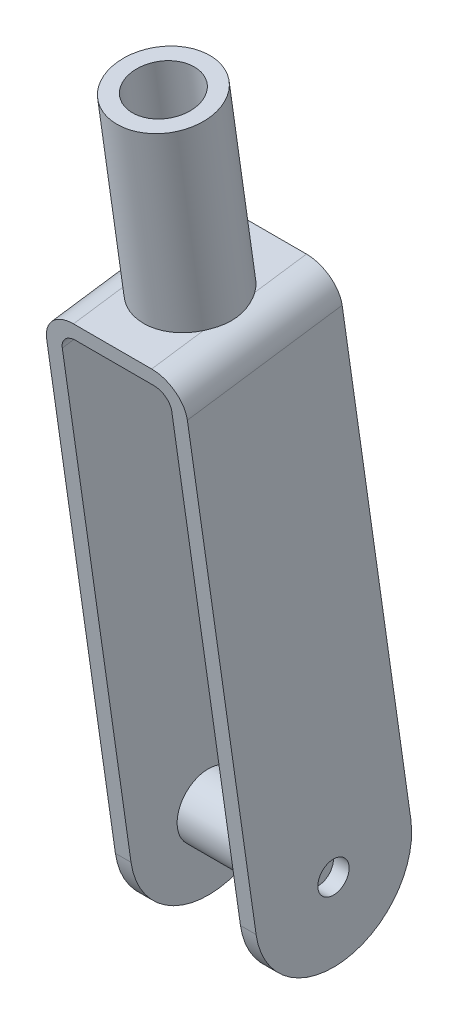
ISO-10303-21;
HEADER;
FILE_DESCRIPTION(('STEP AP214'),'2;1');
FILE_NAME('part.step','',(''),(''),'','','');
FILE_SCHEMA(('AUTOMOTIVE_DESIGN { 1 0 10303 214 1 1 1 1 }'));
ENDSEC;
DATA;
#1=APPLICATION_CONTEXT('core data for automotive mechanical design processes');
#2=APPLICATION_PROTOCOL_DEFINITION('international standard','automotive_design',2000,#1);
#3=PRODUCT_CONTEXT('',#1,'mechanical');
#4=PRODUCT('Part','Part','',(#3));
#5=PRODUCT_RELATED_PRODUCT_CATEGORY('part','',(#4));
#6=PRODUCT_DEFINITION_FORMATION('','',#4);
#7=PRODUCT_DEFINITION_CONTEXT('part definition',#1,'design');
#8=PRODUCT_DEFINITION('design','',#6,#7);
#9=PRODUCT_DEFINITION_SHAPE('','',#8);
#10=(LENGTH_UNIT() NAMED_UNIT(*) SI_UNIT(.MILLI.,.METRE.));
#11=(NAMED_UNIT(*) PLANE_ANGLE_UNIT() SI_UNIT($,.RADIAN.));
#12=(NAMED_UNIT(*) SI_UNIT($,.STERADIAN.) SOLID_ANGLE_UNIT());
#13=UNCERTAINTY_MEASURE_WITH_UNIT(LENGTH_MEASURE(1.E-05),#10,'distance_accuracy_value','');
#14=(GEOMETRIC_REPRESENTATION_CONTEXT(3) GLOBAL_UNCERTAINTY_ASSIGNED_CONTEXT((#13)) GLOBAL_UNIT_ASSIGNED_CONTEXT((#10,
#11,#12)) REPRESENTATION_CONTEXT('',''));
#15=CARTESIAN_POINT('',(0.,0.,0.));
#16=DIRECTION('',(0.,0.,1.));
#17=DIRECTION('',(1.,0.,0.));
#18=AXIS2_PLACEMENT_3D('',#15,#16,#17);
#19=CARTESIAN_POINT('',(83.7499999999986,659.76098798827,-425.51857586841));
#20=DIRECTION('',(-1.,0.,0.));
#21=DIRECTION('',(0.,0.,1.));
#22=AXIS2_PLACEMENT_3D('',#19,#20,#21);
#23=PLANE('',#22);
#24=CARTESIAN_POINT('',(83.7499999999986,660.24088916742,-424.87823749785));
#25=DIRECTION('',(1.,0.,0.));
#26=DIRECTION('',(0.,0.,-1.));
#27=AXIS2_PLACEMENT_3D('',#24,#25,#26);
#28=CIRCLE('',#27,0.499999999999901);
#29=CARTESIAN_POINT('',(83.7499999999986,660.24088916742,-425.37823749785));
#30=VERTEX_POINT('',#29);
#31=EDGE_CURVE('E183',#30,#30,#28,.T.);
#32=ORIENTED_EDGE('',*,*,#31,.T.);
#33=EDGE_LOOP('',(#32));
#34=FACE_BOUND('',#33,.T.);
#35=ADVANCED_FACE('F17',(#34),#23,.F.);
#36=CARTESIAN_POINT('',(80.4999999999986,682.300974259695,-420.203556148117));
#37=DIRECTION('',(0.,0.9898995803359,0.141770310188026));
#38=DIRECTION('',(0.,-0.141770310188026,0.9898995803359));
#39=AXIS2_PLACEMENT_3D('',#36,#37,#38);
#40=PLANE('',#39);
#41=CARTESIAN_POINT('',(81.9999999999987,682.513629724977,-421.688405518621));
#42=DIRECTION('',(0.,-0.989899580335903,-0.141770310188003));
#43=DIRECTION('',(0.,0.141770310188003,-0.989899580335903));
#44=AXIS2_PLACEMENT_3D('',#41,#42,#43);
#45=CIRCLE('',#44,1.00000000000017);
#46=CARTESIAN_POINT('',(81.9999999999987,682.655400035165,-422.678305098957));
#47=VERTEX_POINT('',#46);
#48=EDGE_CURVE('E321',#47,#47,#45,.T.);
#49=ORIENTED_EDGE('',*,*,#48,.T.);
#50=EDGE_LOOP('',(#49));
#51=FACE_BOUND('',#50,.T.);
#52=CARTESIAN_POINT('',(81.9999999999987,682.513629724977,-421.68840551862));
#53=DIRECTION('',(0.,0.989899580335898,0.141770310188037));
#54=DIRECTION('',(0.,-0.141770310188037,0.989899580335898));
#55=AXIS2_PLACEMENT_3D('',#52,#53,#54);
#56=CIRCLE('',#55,1.50000000000002);
#57=CARTESIAN_POINT('',(81.9999999999987,682.300974259695,-420.203556148117));
#58=VERTEX_POINT('',#57);
#59=EDGE_CURVE('E213',#58,#58,#56,.F.);
#60=ORIENTED_EDGE('',*,*,#59,.F.);
#61=EDGE_LOOP('',(#60));
#62=FACE_BOUND('',#61,.T.);
#63=ADVANCED_FACE('F270',(#51,#62),#40,.T.);
#64=CARTESIAN_POINT('',(80.7499999999986,675.584332662626,-422.680797689937));
#65=DIRECTION('',(0.,0.141770310188011,-0.989899580335902));
#66=DIRECTION('',(0.,0.989899580335902,0.141770310188011));
#67=AXIS2_PLACEMENT_3D('',#64,#65,#66);
#68=CYLINDRICAL_SURFACE('',#67,0.5);
#69=DIRECTION('',(0.,-0.14177031018802,0.989899580335901));
#70=VECTOR('',#69,1.);
#71=CARTESIAN_POINT('',(80.2499999999986,675.938758438096,-425.155546640776));
#72=LINE('',#71,#70);
#73=CARTESIAN_POINT('',(80.2499999999986,675.938758438096,-425.155546640776));
#74=VERTEX_POINT('',#73);
#75=CARTESIAN_POINT('',(80.2499999999986,675.229906887156,-420.206048739097));
#76=VERTEX_POINT('',#75);
#77=EDGE_CURVE('E120',#74,#76,#72,.T.);
#78=ORIENTED_EDGE('',*,*,#77,.F.);
#79=CARTESIAN_POINT('',(80.7499999999986,675.938758438096,-425.155546640776));
#80=DIRECTION('',(0.,0.141770310188011,-0.989899580335902));
#81=DIRECTION('',(0.,0.989899580335902,0.141770310188011));
#82=AXIS2_PLACEMENT_3D('',#79,#80,#81);
#83=CIRCLE('',#82,0.5);
#84=CARTESIAN_POINT('',(80.7499999999986,676.433708228264,-425.084661485682));
#85=VERTEX_POINT('',#84);
#86=EDGE_CURVE('E20',#85,#74,#83,.F.);
#87=ORIENTED_EDGE('',*,*,#86,.F.);
#88=DIRECTION('',(0.,0.141770310188011,-0.989899580335902));
#89=VECTOR('',#88,1.);
#90=CARTESIAN_POINT('',(80.7499999999986,676.079282452794,-422.609912534842));
#91=LINE('',#90,#89);
#92=CARTESIAN_POINT('',(80.7499999999986,675.724856677324,-420.135163584003));
#93=VERTEX_POINT('',#92);
#94=EDGE_CURVE('E166',#93,#85,#91,.T.);
#95=ORIENTED_EDGE('',*,*,#94,.F.);
#96=CARTESIAN_POINT('',(80.7499999999986,675.229906887156,-420.206048739097));
#97=DIRECTION('',(0.,0.141770310188011,-0.989899580335902));
#98=DIRECTION('',(0.,0.989899580335902,0.141770310188011));
#99=AXIS2_PLACEMENT_3D('',#96,#97,#98);
#100=CIRCLE('',#99,0.5);
#101=EDGE_CURVE('E118',#76,#93,#100,.T.);
#102=ORIENTED_EDGE('',*,*,#101,.F.);
#103=EDGE_LOOP('',(#78,#87,#95,#102));
#104=FACE_BOUND('',#103,.T.);
#105=ADVANCED_FACE('F121',(#104),#68,.F.);
#106=CARTESIAN_POINT('',(81.9999999999987,682.791471513221,-421.64861388997));
#107=DIRECTION('',(0.,-0.989899580335903,-0.141770310188003));
#108=DIRECTION('',(0.,0.141770310188003,-0.989899580335903));
#109=AXIS2_PLACEMENT_3D('',#106,#107,#108);
#110=CYLINDRICAL_SURFACE('',#109,1.00000000000017);
#111=CARTESIAN_POINT('',(81.9999999999987,676.079282452794,-422.609912534843));
#112=DIRECTION('',(0.,-0.989899580335903,-0.141770310188003));
#113=DIRECTION('',(0.,0.141770310188003,-0.989899580335903));
#114=AXIS2_PLACEMENT_3D('',#111,#112,#113);
#115=CIRCLE('',#114,1.00000000000017);
#116=CARTESIAN_POINT('',(81.9999999999987,676.221052762982,-423.599812115179));
#117=VERTEX_POINT('',#116);
#118=EDGE_CURVE('E170',#117,#117,#115,.F.);
#119=ORIENTED_EDGE('',*,*,#118,.F.);
#120=EDGE_LOOP('',(#119));
#121=FACE_BOUND('',#120,.T.);
#122=ORIENTED_EDGE('',*,*,#48,.F.);
#123=EDGE_LOOP('',(#122));
#124=FACE_BOUND('',#123,.T.);
#125=ADVANCED_FACE('F264',(#121,#124),#110,.F.);
#126=CARTESIAN_POINT('',(83.2499999999986,675.584332662626,-422.680797689937));
#127=DIRECTION('',(0.,-0.141770310188011,0.989899580335902));
#128=DIRECTION('',(0.,-0.989899580335902,-0.141770310188011));
#129=AXIS2_PLACEMENT_3D('',#126,#127,#128);
#130=CYLINDRICAL_SURFACE('',#129,0.5);
#131=DIRECTION('',(0.,-0.14177031018802,0.989899580335901));
#132=VECTOR('',#131,1.);
#133=CARTESIAN_POINT('',(83.7499999999986,675.938758438096,-425.155546640776));
#134=LINE('',#133,#132);
#135=CARTESIAN_POINT('',(83.7499999999986,675.938758438096,-425.155546640776));
#136=VERTEX_POINT('',#135);
#137=CARTESIAN_POINT('',(83.7499999999986,675.229906887156,-420.206048739097));
#138=VERTEX_POINT('',#137);
#139=EDGE_CURVE('E162',#136,#138,#134,.T.);
#140=ORIENTED_EDGE('',*,*,#139,.T.);
#141=CARTESIAN_POINT('',(83.2499999999986,675.229906887156,-420.206048739097));
#142=DIRECTION('',(0.,-0.141770310188011,0.989899580335902));
#143=DIRECTION('',(0.,-0.989899580335902,-0.141770310188011));
#144=AXIS2_PLACEMENT_3D('',#141,#142,#143);
#145=CIRCLE('',#144,0.5);
#146=CARTESIAN_POINT('',(83.2499999999986,675.724856677324,-420.135163584003));
#147=VERTEX_POINT('',#146);
#148=EDGE_CURVE('E320',#147,#138,#145,.F.);
#149=ORIENTED_EDGE('',*,*,#148,.F.);
#150=DIRECTION('',(0.,0.141770310188011,-0.989899580335902));
#151=VECTOR('',#150,1.);
#152=CARTESIAN_POINT('',(83.2499999999986,676.079282452794,-422.609912534842));
#153=LINE('',#152,#151);
#154=CARTESIAN_POINT('',(83.2499999999986,676.433708228264,-425.084661485682));
#155=VERTEX_POINT('',#154);
#156=EDGE_CURVE('E168',#155,#147,#153,.F.);
#157=ORIENTED_EDGE('',*,*,#156,.F.);
#158=CARTESIAN_POINT('',(83.2499999999986,675.938758438096,-425.155546640776));
#159=DIRECTION('',(0.,-0.141770310188011,0.989899580335902));
#160=DIRECTION('',(0.,-0.989899580335902,-0.141770310188011));
#161=AXIS2_PLACEMENT_3D('',#158,#159,#160);
#162=CIRCLE('',#161,0.5);
#163=EDGE_CURVE('E314',#136,#155,#162,.T.);
#164=ORIENTED_EDGE('',*,*,#163,.F.);
#165=EDGE_LOOP('',(#140,#149,#157,#164));
#166=FACE_BOUND('',#165,.T.);
#167=ADVANCED_FACE('F260',(#166),#130,.F.);
#168=CARTESIAN_POINT('',(80.2499999999986,660.24088916742,-424.878237497851));
#169=DIRECTION('',(1.,0.,0.));
#170=DIRECTION('',(0.,0.,-1.));
#171=AXIS2_PLACEMENT_3D('',#168,#169,#170);
#172=CYLINDRICAL_SURFACE('',#171,0.999999999999979);
#173=CARTESIAN_POINT('',(80.2499999999986,660.24088916742,-424.878237497851));
#174=DIRECTION('',(1.,0.,0.));
#175=DIRECTION('',(0.,0.,-1.));
#176=AXIS2_PLACEMENT_3D('',#173,#174,#175);
#177=CIRCLE('',#176,0.999999999999979);
#178=CARTESIAN_POINT('',(80.2499999999986,660.24088916742,-425.878237497851));
#179=VERTEX_POINT('',#178);
#180=EDGE_CURVE('E125',#179,#179,#177,.F.);
#181=ORIENTED_EDGE('',*,*,#180,.F.);
#182=EDGE_LOOP('',(#181));
#183=FACE_BOUND('',#182,.T.);
#184=CARTESIAN_POINT('',(83.7499999999986,660.24088916742,-424.878237497851));
#185=DIRECTION('',(1.,0.,0.));
#186=DIRECTION('',(0.,0.,-1.));
#187=AXIS2_PLACEMENT_3D('',#184,#185,#186);
#188=CIRCLE('',#187,0.999999999999979);
#189=CARTESIAN_POINT('',(83.7499999999986,660.24088916742,-425.878237497851));
#190=VERTEX_POINT('',#189);
#191=EDGE_CURVE('E161',#190,#190,#188,.F.);
#192=ORIENTED_EDGE('',*,*,#191,.T.);
#193=EDGE_LOOP('',(#192));
#194=FACE_BOUND('',#193,.T.);
#195=ADVANCED_FACE('F256',(#183,#194),#172,.T.);
#196=CARTESIAN_POINT('',(83.2499999999986,675.584332662626,-422.680797689937));
#197=DIRECTION('',(0.,-0.141770310188011,0.989899580335902));
#198=DIRECTION('',(0.,-0.989899580335902,-0.141770310188011));
#199=AXIS2_PLACEMENT_3D('',#196,#197,#198);
#200=CYLINDRICAL_SURFACE('',#199,1.);
#201=CARTESIAN_POINT('',(83.2499999999991,676.456682511635,-421.718246007723));
#202=CARTESIAN_POINT('',(83.273541702454,676.461702346796,-421.753371579007));
#203=CARTESIAN_POINT('',(83.2955548521709,676.466060837471,-421.789593470289));
#204=CARTESIAN_POINT('',(83.3363884443306,676.473977122691,-421.863872979547));
#205=CARTESIAN_POINT('',(83.3552093841129,676.477535041993,-421.901930310377));
#206=CARTESIAN_POINT('',(83.3894962434916,676.484366615452,-421.979457773463));
#207=CARTESIAN_POINT('',(83.4049687624612,676.487640820994,-422.018924944766));
#208=CARTESIAN_POINT('',(83.4325066628532,676.49434685667,-422.099004243826));
#209=CARTESIAN_POINT('',(83.4445726916694,676.497778656708,-422.139616152413));
#210=CARTESIAN_POINT('',(83.469842142181,676.50682390006,-422.240060271061));
#211=CARTESIAN_POINT('',(83.4811369042233,676.512726265391,-422.300358392347));
#212=CARTESIAN_POINT('',(83.4962142639735,676.526357754796,-422.421666980752));
#213=CARTESIAN_POINT('',(83.4999994409079,676.53408625065,-422.482677196051));
#214=CARTESIAN_POINT('',(83.5000003864045,676.548820341481,-422.585585950522));
#215=CARTESIAN_POINT('',(83.4981929973668,676.555311924659,-422.627567141019));
#216=CARTESIAN_POINT('',(83.490987450683,676.569108104604,-422.711087509576));
#217=CARTESIAN_POINT('',(83.4855883587869,676.57641291249,-422.752626569775));
#218=CARTESIAN_POINT('',(83.4640344179335,676.599238217735,-422.876242694183));
#219=CARTESIAN_POINT('',(83.4425229326354,676.615665571805,-422.957291926682));
#220=CARTESIAN_POINT('',(83.3937095790683,676.643277804214,-423.092837437905));
#221=CARTESIAN_POINT('',(83.3696395256912,676.654659315349,-423.148493457853));
#222=CARTESIAN_POINT('',(83.3147729207722,676.675254962681,-423.256617593896));
#223=CARTESIAN_POINT('',(83.2839936710839,676.684474549449,-423.309093474176));
#224=CARTESIAN_POINT('',(83.2499999999986,676.691781974288,-423.359808751775));
#225=B_SPLINE_CURVE_WITH_KNOTS('',3,(#201,#202,#203,#204,#205,#206,#207,#208,#209,#210,#211,
#212,#213,#214,#215,#216,#217,#218,#219,#220,#221,#222,#223,#224),.UNSPECIFIED.,.F.,.F.,(4,2,2,
2,2,2,2,2,2,2,2,4),(0.,0.127673187185261,0.255326464850618,0.382725813066617,0.510100933076331,
0.694494151759629,0.87882402816004,1.00622036982498,1.13364986194292,1.38858900338883,
1.57323697863546,1.75741429651656),.UNSPECIFIED.);
#226=CARTESIAN_POINT('',(83.2499999999988,676.456682511635,-421.718246007722));
#227=VERTEX_POINT('',#226);
#228=CARTESIAN_POINT('',(83.2499999999986,676.691781974288,-423.359808751775));
#229=VERTEX_POINT('',#228);
#230=EDGE_CURVE('E225',#227,#229,#225,.T.);
#231=ORIENTED_EDGE('',*,*,#230,.F.);
#232=DIRECTION('',(0.,0.141770310188011,-0.989899580335902));
#233=VECTOR('',#232,1.);
#234=CARTESIAN_POINT('',(83.2499999999986,676.574232242962,-422.539027379749));
#235=LINE('',#234,#233);
#236=CARTESIAN_POINT('',(83.2499999999986,676.219806467492,-420.064278428909));
#237=VERTEX_POINT('',#236);
#238=EDGE_CURVE('E174',#227,#237,#235,.F.);
#239=ORIENTED_EDGE('',*,*,#238,.T.);
#240=CARTESIAN_POINT('',(83.2499999999986,675.229906887156,-420.206048739097));
#241=DIRECTION('',(0.,-0.141770310188011,0.989899580335902));
#242=DIRECTION('',(0.,-0.989899580335902,-0.141770310188011));
#243=AXIS2_PLACEMENT_3D('',#240,#241,#242);
#244=CIRCLE('',#243,1.);
#245=CARTESIAN_POINT('',(84.2499999999986,675.229906887156,-420.206048739097));
#246=VERTEX_POINT('',#245);
#247=EDGE_CURVE('E323',#237,#246,#244,.F.);
#248=ORIENTED_EDGE('',*,*,#247,.T.);
#249=DIRECTION('',(0.,-0.14177031018802,0.989899580335901));
#250=VECTOR('',#249,1.);
#251=CARTESIAN_POINT('',(84.2499999999986,675.938758438096,-425.155546640776));
#252=LINE('',#251,#250);
#253=CARTESIAN_POINT('',(84.2499999999986,675.938758438096,-425.155546640776));
#254=VERTEX_POINT('',#253);
#255=EDGE_CURVE('E157',#254,#246,#252,.T.);
#256=ORIENTED_EDGE('',*,*,#255,.F.);
#257=CARTESIAN_POINT('',(83.2499999999986,675.938758438096,-425.155546640776));
#258=DIRECTION('',(0.,-0.141770310188011,0.989899580335902));
#259=DIRECTION('',(0.,-0.989899580335902,-0.141770310188011));
#260=AXIS2_PLACEMENT_3D('',#257,#258,#259);
#261=CIRCLE('',#260,1.);
#262=CARTESIAN_POINT('',(83.2499999999986,676.928658018432,-425.013776330588));
#263=VERTEX_POINT('',#262);
#264=EDGE_CURVE('E185',#254,#263,#261,.T.);
#265=ORIENTED_EDGE('',*,*,#264,.T.);
#266=DIRECTION('',(0.,-0.141770310188011,0.989899580335902));
#267=VECTOR('',#266,1.);
#268=CARTESIAN_POINT('',(83.2499999999986,676.574232242962,-422.539027379749));
#269=LINE('',#268,#267);
#270=EDGE_CURVE('E181',#263,#229,#269,.T.);
#271=ORIENTED_EDGE('',*,*,#270,.T.);
#272=EDGE_LOOP('',(#231,#239,#248,#256,#265,#271));
#273=FACE_BOUND('',#272,.T.);
#274=ADVANCED_FACE('F251',(#273),#200,.T.);
#275=CARTESIAN_POINT('',(83.7499999999986,660.240889167419,-424.878237497851));
#276=DIRECTION('',(1.,0.,0.));
#277=DIRECTION('',(0.,0.,-1.));
#278=AXIS2_PLACEMENT_3D('',#275,#276,#277);
#279=CYLINDRICAL_SURFACE('',#278,2.49999999999985);
#280=CARTESIAN_POINT('',(84.2499999999986,660.240889167419,-424.878237497851));
#281=DIRECTION('',(1.,0.,0.));
#282=DIRECTION('',(0.,0.,-1.));
#283=AXIS2_PLACEMENT_3D('',#280,#281,#282);
#284=CIRCLE('',#283,2.49999999999985);
#285=CARTESIAN_POINT('',(84.2499999999986,659.886463391949,-422.403488547011));
#286=VERTEX_POINT('',#285);
#287=CARTESIAN_POINT('',(84.2499999999986,660.59531494289,-427.35298644869));
#288=VERTEX_POINT('',#287);
#289=EDGE_CURVE('E160',#286,#288,#284,.T.);
#290=ORIENTED_EDGE('',*,*,#289,.F.);
#291=DIRECTION('',(1.,0.,0.));
#292=VECTOR('',#291,1.);
#293=CARTESIAN_POINT('',(83.7499999999986,659.886463391949,-422.403488547011));
#294=LINE('',#293,#292);
#295=CARTESIAN_POINT('',(83.7499999999986,659.886463391949,-422.403488547011));
#296=VERTEX_POINT('',#295);
#297=EDGE_CURVE('E180',#286,#296,#294,.F.);
#298=ORIENTED_EDGE('',*,*,#297,.T.);
#299=CARTESIAN_POINT('',(83.7499999999986,660.240889167419,-424.878237497851));
#300=DIRECTION('',(1.,0.,0.));
#301=DIRECTION('',(0.,0.,-1.));
#302=AXIS2_PLACEMENT_3D('',#299,#300,#301);
#303=CIRCLE('',#302,2.49999999999985);
#304=CARTESIAN_POINT('',(83.7499999999986,660.59531494289,-427.35298644869));
#305=VERTEX_POINT('',#304);
#306=EDGE_CURVE('E165',#296,#305,#303,.T.);
#307=ORIENTED_EDGE('',*,*,#306,.T.);
#308=DIRECTION('',(1.,0.,0.));
#309=VECTOR('',#308,1.);
#310=CARTESIAN_POINT('',(83.7499999999986,660.59531494289,-427.35298644869));
#311=LINE('',#310,#309);
#312=EDGE_CURVE('E178',#305,#288,#311,.T.);
#313=ORIENTED_EDGE('',*,*,#312,.T.);
#314=EDGE_LOOP('',(#290,#298,#307,#313));
#315=FACE_BOUND('',#314,.T.);
#316=ADVANCED_FACE('F248',(#315),#279,.T.);
#317=CARTESIAN_POINT('',(83.7499999999986,660.24088916742,-424.87823749785));
#318=DIRECTION('',(1.,0.,0.));
#319=DIRECTION('',(0.,0.,-1.));
#320=AXIS2_PLACEMENT_3D('',#317,#318,#319);
#321=CYLINDRICAL_SURFACE('',#320,0.499999999999901);
#322=CARTESIAN_POINT('',(84.2499999999986,660.24088916742,-424.87823749785));
#323=DIRECTION('',(1.,0.,0.));
#324=DIRECTION('',(0.,0.,-1.));
#325=AXIS2_PLACEMENT_3D('',#322,#323,#324);
#326=CIRCLE('',#325,0.499999999999901);
#327=CARTESIAN_POINT('',(84.2499999999986,660.24088916742,-425.37823749785));
#328=VERTEX_POINT('',#327);
#329=EDGE_CURVE('E198',#328,#328,#326,.F.);
#330=ORIENTED_EDGE('',*,*,#329,.F.);
#331=EDGE_LOOP('',(#330));
#332=FACE_BOUND('',#331,.T.);
#333=ORIENTED_EDGE('',*,*,#31,.F.);
#334=EDGE_LOOP('',(#333));
#335=FACE_BOUND('',#334,.T.);
#336=ADVANCED_FACE('F242',(#332,#335),#321,.F.);
#337=CARTESIAN_POINT('',(81.9999999999987,676.334792444548,-422.573319195976));
#338=DIRECTION('',(0.,0.989899580335898,0.141770310188037));
#339=DIRECTION('',(0.,-0.141770310188037,0.989899580335898));
#340=AXIS2_PLACEMENT_3D('',#337,#338,#339);
#341=CYLINDRICAL_SURFACE('',#340,1.50000000000002);
#342=CARTESIAN_POINT('',(81.9999999999987,676.574232242961,-422.539027379748));
#343=DIRECTION('',(0.,0.989899580335899,0.141770310188032));
#344=DIRECTION('',(0.,-0.141770310188032,0.989899580335899));
#345=AXIS2_PLACEMENT_3D('',#342,#343,#344);
#346=CIRCLE('',#345,1.49999999999999);
#347=CARTESIAN_POINT('',(80.7499999999985,676.456682511635,-421.718246007723));
#348=VERTEX_POINT('',#347);
#349=EDGE_CURVE('E177',#348,#227,#346,.T.);
#350=ORIENTED_EDGE('',*,*,#349,.T.);
#351=ORIENTED_EDGE('',*,*,#230,.T.);
#352=CARTESIAN_POINT('',(81.9999999999987,676.574232242962,-422.539027379749));
#353=DIRECTION('',(0.,0.989899580335898,0.141770310188037));
#354=DIRECTION('',(0.,-0.141770310188037,0.989899580335898));
#355=AXIS2_PLACEMENT_3D('',#352,#353,#354);
#356=CIRCLE('',#355,1.50000000000002);
#357=CARTESIAN_POINT('',(80.7499999999988,676.691781974288,-423.359808751775));
#358=VERTEX_POINT('',#357);
#359=EDGE_CURVE('E156',#229,#358,#356,.T.);
#360=ORIENTED_EDGE('',*,*,#359,.T.);
#361=CARTESIAN_POINT('',(80.7499999999988,676.691781974288,-423.359808751775));
#362=CARTESIAN_POINT('',(80.7264582975438,676.686741093036,-423.324686194646));
#363=CARTESIAN_POINT('',(80.7044451478269,676.680757740262,-423.288697011013));
#364=CARTESIAN_POINT('',(80.6636115556672,676.667507278895,-423.215181445716));
#365=CARTESIAN_POINT('',(80.6447906158849,676.660240370638,-423.17765530464));
#366=CARTESIAN_POINT('',(80.6105037565061,676.645037175269,-423.101326798962));
#367=CARTESIAN_POINT('',(80.5950312375365,676.637102248448,-423.062527121529));
#368=CARTESIAN_POINT('',(80.5674933371444,676.621062320613,-422.983784593201));
#369=CARTESIAN_POINT('',(80.5554273083282,676.61295735223,-422.943841961113));
#370=CARTESIAN_POINT('',(80.5301578578165,676.593446670244,-422.844896669731));
#371=CARTESIAN_POINT('',(80.5188630957742,676.58218749423,-422.785365734053));
#372=CARTESIAN_POINT('',(80.5037857360239,676.561222530645,-422.665107422798));
#373=CARTESIAN_POINT('',(80.5000005590895,676.551516210786,-422.604380465243));
#374=CARTESIAN_POINT('',(80.499999613593,676.536773932076,-422.501472883414));
#375=CARTESIAN_POINT('',(80.5018070026306,676.531221425182,-422.45935720136));
#376=CARTESIAN_POINT('',(80.5090125493145,676.521020806365,-422.375321887826));
#377=CARTESIAN_POINT('',(80.5144116412106,676.516372930156,-422.333402310214));
#378=CARTESIAN_POINT('',(80.535965582064,676.50358454101,-422.208348730191));
#379=CARTESIAN_POINT('',(80.5574770673621,676.496602919739,-422.125946709496));
#380=CARTESIAN_POINT('',(80.6062904209292,676.485060733159,-421.98809969676));
#381=CARTESIAN_POINT('',(80.6303604743062,676.480363384085,-421.931486392106));
#382=CARTESIAN_POINT('',(80.685227079225,676.469783204825,-421.821927872169));
#383=CARTESIAN_POINT('',(80.7160063289132,676.463903426883,-421.768973674954));
#384=CARTESIAN_POINT('',(80.7499999999983,676.456682511635,-421.718246007723));
#385=B_SPLINE_CURVE_WITH_KNOTS('',3,(#361,#362,#363,#364,#365,#366,#367,#368,#369,#370,#371,
#372,#373,#374,#375,#376,#377,#378,#379,#380,#381,#382,#383,#384),.UNSPECIFIED.,.F.,.F.,(4,2,2,
2,2,2,2,2,2,2,2,4),(0.,0.127673187185239,0.255326464850496,0.382725813066447,0.510100933076255,
0.694494151760142,0.878824028161298,1.00622036982625,1.13364986194423,1.38858900339003,
1.57323697863591,1.75741429651643),.UNSPECIFIED.);
#386=EDGE_CURVE('E216',#358,#348,#385,.T.);
#387=ORIENTED_EDGE('',*,*,#386,.T.);
#388=EDGE_LOOP('',(#350,#351,#360,#387));
#389=FACE_BOUND('',#388,.T.);
#390=ORIENTED_EDGE('',*,*,#59,.T.);
#391=EDGE_LOOP('',(#390));
#392=FACE_BOUND('',#391,.T.);
#393=ADVANCED_FACE('F236',(#389,#392),#341,.T.);
#394=CARTESIAN_POINT('',(81.9999999999987,676.574232242962,-422.539027379749));
#395=DIRECTION('',(0.,-0.989899580335902,-0.141770310188011));
#396=DIRECTION('',(0.,0.141770310188011,-0.989899580335902));
#397=AXIS2_PLACEMENT_3D('',#394,#395,#396);
#398=PLANE('',#397);
#399=DIRECTION('',(1.,0.,0.));
#400=VECTOR('',#399,1.);
#401=CARTESIAN_POINT('',(81.9999999999987,676.219806467492,-420.064278428909));
#402=LINE('',#401,#400);
#403=CARTESIAN_POINT('',(80.7499999999986,676.219806467492,-420.064278428909));
#404=VERTEX_POINT('',#403);
#405=EDGE_CURVE('E151',#404,#237,#402,.T.);
#406=ORIENTED_EDGE('',*,*,#405,.T.);
#407=ORIENTED_EDGE('',*,*,#238,.F.);
#408=ORIENTED_EDGE('',*,*,#349,.F.);
#409=DIRECTION('',(0.,0.141770310188011,-0.989899580335902));
#410=VECTOR('',#409,1.);
#411=CARTESIAN_POINT('',(80.7499999999986,676.574232242962,-422.539027379749));
#412=LINE('',#411,#410);
#413=EDGE_CURVE('E126',#404,#348,#412,.T.);
#414=ORIENTED_EDGE('',*,*,#413,.F.);
#415=EDGE_LOOP('',(#406,#407,#408,#414));
#416=FACE_BOUND('',#415,.T.);
#417=ADVANCED_FACE('F241',(#416),#398,.F.);
#418=CARTESIAN_POINT('',(80.2499999999986,666.180286649435,-424.027615636723));
#419=DIRECTION('',(1.,0.,0.));
#420=DIRECTION('',(0.,0.,-1.));
#421=AXIS2_PLACEMENT_3D('',#418,#419,#420);
#422=PLANE('',#421);
#423=ORIENTED_EDGE('',*,*,#180,.T.);
#424=EDGE_LOOP('',(#423));
#425=FACE_BOUND('',#424,.T.);
#426=CARTESIAN_POINT('',(80.2499999999986,660.240889167419,-424.878237497851));
#427=DIRECTION('',(1.,0.,0.));
#428=DIRECTION('',(0.,0.,-1.));
#429=AXIS2_PLACEMENT_3D('',#426,#427,#428);
#430=CIRCLE('',#429,2.49999999999985);
#431=CARTESIAN_POINT('',(80.2499999999986,660.59531494289,-427.35298644869));
#432=VERTEX_POINT('',#431);
#433=CARTESIAN_POINT('',(80.2499999999986,659.886463391949,-422.403488547011));
#434=VERTEX_POINT('',#433);
#435=EDGE_CURVE('E129',#432,#434,#430,.F.);
#436=ORIENTED_EDGE('',*,*,#435,.F.);
#437=DIRECTION('',(0.,-0.989899580335902,-0.141770310188011));
#438=VECTOR('',#437,1.);
#439=CARTESIAN_POINT('',(80.2499999999986,667.524612005241,-426.360594277374));
#440=LINE('',#439,#438);
#441=EDGE_CURVE('E111',#432,#74,#440,.F.);
#442=ORIENTED_EDGE('',*,*,#441,.T.);
#443=ORIENTED_EDGE('',*,*,#77,.T.);
#444=DIRECTION('',(0.,0.989899580335902,0.141770310188011));
#445=VECTOR('',#444,1.);
#446=CARTESIAN_POINT('',(80.2499999999986,666.815760454301,-421.411096375695));
#447=LINE('',#446,#445);
#448=EDGE_CURVE('E140',#76,#434,#447,.F.);
#449=ORIENTED_EDGE('',*,*,#448,.T.);
#450=EDGE_LOOP('',(#436,#442,#443,#449));
#451=FACE_BOUND('',#450,.T.);
#452=ADVANCED_FACE('F128',(#425,#451),#422,.T.);
#453=CARTESIAN_POINT('',(81.9999999999987,676.079282452794,-422.609912534842));
#454=DIRECTION('',(0.,-0.989899580335902,-0.141770310188011));
#455=DIRECTION('',(0.,0.141770310188011,-0.989899580335902));
#456=AXIS2_PLACEMENT_3D('',#453,#454,#455);
#457=PLANE('',#456);
#458=ORIENTED_EDGE('',*,*,#118,.T.);
#459=EDGE_LOOP('',(#458));
#460=FACE_BOUND('',#459,.T.);
#461=ORIENTED_EDGE('',*,*,#156,.T.);
#462=DIRECTION('',(1.,0.,0.));
#463=VECTOR('',#462,1.);
#464=CARTESIAN_POINT('',(81.9999999999987,675.724856677324,-420.135163584003));
#465=LINE('',#464,#463);
#466=EDGE_CURVE('E142',#147,#93,#465,.F.);
#467=ORIENTED_EDGE('',*,*,#466,.T.);
#468=ORIENTED_EDGE('',*,*,#94,.T.);
#469=DIRECTION('',(1.,0.,0.));
#470=VECTOR('',#469,1.);
#471=CARTESIAN_POINT('',(81.9999999999987,676.433708228264,-425.084661485682));
#472=LINE('',#471,#470);
#473=EDGE_CURVE('E114',#85,#155,#472,.T.);
#474=ORIENTED_EDGE('',*,*,#473,.T.);
#475=EDGE_LOOP('',(#461,#467,#468,#474));
#476=FACE_BOUND('',#475,.T.);
#477=ADVANCED_FACE('F329',(#460,#476),#457,.T.);
#478=CARTESIAN_POINT('',(83.7499999999986,666.180286649435,-424.027615636723));
#479=DIRECTION('',(1.,0.,0.));
#480=DIRECTION('',(0.,0.,-1.));
#481=AXIS2_PLACEMENT_3D('',#478,#479,#480);
#482=PLANE('',#481);
#483=ORIENTED_EDGE('',*,*,#191,.F.);
#484=EDGE_LOOP('',(#483));
#485=FACE_BOUND('',#484,.T.);
#486=DIRECTION('',(0.,-0.989899580335902,-0.141770310188011));
#487=VECTOR('',#486,1.);
#488=CARTESIAN_POINT('',(83.7499999999986,667.524612005241,-426.360594277374));
#489=LINE('',#488,#487);
#490=EDGE_CURVE('E132',#136,#305,#489,.T.);
#491=ORIENTED_EDGE('',*,*,#490,.T.);
#492=ORIENTED_EDGE('',*,*,#306,.F.);
#493=DIRECTION('',(0.,0.989899580335902,0.141770310188011));
#494=VECTOR('',#493,1.);
#495=CARTESIAN_POINT('',(83.7499999999986,666.815760454301,-421.411096375695));
#496=LINE('',#495,#494);
#497=EDGE_CURVE('E145',#296,#138,#496,.T.);
#498=ORIENTED_EDGE('',*,*,#497,.T.);
#499=ORIENTED_EDGE('',*,*,#139,.F.);
#500=EDGE_LOOP('',(#491,#492,#498,#499));
#501=FACE_BOUND('',#500,.T.);
#502=ADVANCED_FACE('F312',(#485,#501),#482,.F.);
#503=CARTESIAN_POINT('',(84.2499999999986,667.170186229771,-423.885845326535));
#504=DIRECTION('',(1.,0.,0.));
#505=DIRECTION('',(0.,0.,-1.));
#506=AXIS2_PLACEMENT_3D('',#503,#504,#505);
#507=PLANE('',#506);
#508=ORIENTED_EDGE('',*,*,#329,.T.);
#509=EDGE_LOOP('',(#508));
#510=FACE_BOUND('',#509,.T.);
#511=ORIENTED_EDGE('',*,*,#289,.T.);
#512=DIRECTION('',(0.,-0.989899580335902,-0.141770310188011));
#513=VECTOR('',#512,1.);
#514=CARTESIAN_POINT('',(84.2499999999986,667.524612005241,-426.360594277374));
#515=LINE('',#514,#513);
#516=EDGE_CURVE('E305',#288,#254,#515,.F.);
#517=ORIENTED_EDGE('',*,*,#516,.T.);
#518=ORIENTED_EDGE('',*,*,#255,.T.);
#519=DIRECTION('',(0.,0.989899580335902,0.141770310188011));
#520=VECTOR('',#519,1.);
#521=CARTESIAN_POINT('',(84.2499999999986,666.815760454301,-421.411096375695));
#522=LINE('',#521,#520);
#523=EDGE_CURVE('E148',#246,#286,#522,.F.);
#524=ORIENTED_EDGE('',*,*,#523,.T.);
#525=EDGE_LOOP('',(#511,#517,#518,#524));
#526=FACE_BOUND('',#525,.T.);
#527=ADVANCED_FACE('F337',(#510,#526),#507,.T.);
#528=CARTESIAN_POINT('',(81.9999999999987,676.574232242962,-422.539027379749));
#529=DIRECTION('',(0.,-0.989899580335902,-0.141770310188011));
#530=DIRECTION('',(0.,0.141770310188011,-0.989899580335902));
#531=AXIS2_PLACEMENT_3D('',#528,#529,#530);
#532=PLANE('',#531);
#533=ORIENTED_EDGE('',*,*,#359,.F.);
#534=ORIENTED_EDGE('',*,*,#270,.F.);
#535=DIRECTION('',(1.,0.,0.));
#536=VECTOR('',#535,1.);
#537=CARTESIAN_POINT('',(81.9999999999987,676.928658018432,-425.013776330588));
#538=LINE('',#537,#536);
#539=CARTESIAN_POINT('',(80.7499999999986,676.928658018432,-425.013776330588));
#540=VERTEX_POINT('',#539);
#541=EDGE_CURVE('E194',#263,#540,#538,.F.);
#542=ORIENTED_EDGE('',*,*,#541,.T.);
#543=DIRECTION('',(0.,0.141770310188011,-0.989899580335902));
#544=VECTOR('',#543,1.);
#545=CARTESIAN_POINT('',(80.7499999999987,676.574232242962,-422.539027379749));
#546=LINE('',#545,#544);
#547=EDGE_CURVE('E154',#358,#540,#546,.T.);
#548=ORIENTED_EDGE('',*,*,#547,.F.);
#549=EDGE_LOOP('',(#533,#534,#542,#548));
#550=FACE_BOUND('',#549,.T.);
#551=ADVANCED_FACE('F344',(#550),#532,.F.);
#552=CARTESIAN_POINT('',(81.9999999999987,666.815760454301,-421.411096375695));
#553=DIRECTION('',(0.,0.141770310188011,-0.989899580335902));
#554=DIRECTION('',(0.,0.989899580335902,0.141770310188011));
#555=AXIS2_PLACEMENT_3D('',#552,#553,#554);
#556=PLANE('',#555);
#557=DIRECTION('',(0.,-0.989899580335904,-0.141770310187998));
#558=VECTOR('',#557,1.);
#559=CARTESIAN_POINT('',(79.7499999999986,675.229906887156,-420.206048739097));
#560=LINE('',#559,#558);
#561=CARTESIAN_POINT('',(79.7499999999986,675.229906887156,-420.206048739097));
#562=VERTEX_POINT('',#561);
#563=CARTESIAN_POINT('',(79.7499999999986,659.886463391949,-422.403488547011));
#564=VERTEX_POINT('',#563);
#565=EDGE_CURVE('E189',#562,#564,#560,.T.);
#566=ORIENTED_EDGE('',*,*,#565,.T.);
#567=DIRECTION('',(1.,0.,0.));
#568=VECTOR('',#567,1.);
#569=CARTESIAN_POINT('',(79.7499999999986,659.88646339195,-422.403488547011));
#570=LINE('',#569,#568);
#571=EDGE_CURVE('E134',#434,#564,#570,.F.);
#572=ORIENTED_EDGE('',*,*,#571,.F.);
#573=ORIENTED_EDGE('',*,*,#448,.F.);
#574=ORIENTED_EDGE('',*,*,#101,.T.);
#575=ORIENTED_EDGE('',*,*,#466,.F.);
#576=ORIENTED_EDGE('',*,*,#148,.T.);
#577=ORIENTED_EDGE('',*,*,#497,.F.);
#578=ORIENTED_EDGE('',*,*,#297,.F.);
#579=ORIENTED_EDGE('',*,*,#523,.F.);
#580=ORIENTED_EDGE('',*,*,#247,.F.);
#581=ORIENTED_EDGE('',*,*,#405,.F.);
#582=CARTESIAN_POINT('',(80.7499999999986,675.229906887156,-420.206048739097));
#583=DIRECTION('',(0.,0.141770310188011,-0.989899580335902));
#584=DIRECTION('',(0.,0.989899580335902,0.141770310188011));
#585=AXIS2_PLACEMENT_3D('',#582,#583,#584);
#586=CIRCLE('',#585,1.);
#587=EDGE_CURVE('E190',#562,#404,#586,.T.);
#588=ORIENTED_EDGE('',*,*,#587,.F.);
#589=EDGE_LOOP('',(#566,#572,#573,#574,#575,#576,#577,#578,#579,#580,#581,#588));
#590=FACE_BOUND('',#589,.T.);
#591=ADVANCED_FACE('F298',(#590),#556,.F.);
#592=CARTESIAN_POINT('',(79.7499999999986,660.240889167419,-424.878237497851));
#593=DIRECTION('',(1.,0.,0.));
#594=DIRECTION('',(0.,0.,-1.));
#595=AXIS2_PLACEMENT_3D('',#592,#593,#594);
#596=CYLINDRICAL_SURFACE('',#595,2.49999999999985);
#597=CARTESIAN_POINT('',(79.7499999999986,660.240889167419,-424.878237497851));
#598=DIRECTION('',(1.,0.,0.));
#599=DIRECTION('',(0.,0.,-1.));
#600=AXIS2_PLACEMENT_3D('',#597,#598,#599);
#601=CIRCLE('',#600,2.49999999999985);
#602=CARTESIAN_POINT('',(79.7499999999986,660.59531494289,-427.35298644869));
#603=VERTEX_POINT('',#602);
#604=EDGE_CURVE('E186',#564,#603,#601,.T.);
#605=ORIENTED_EDGE('',*,*,#604,.T.);
#606=DIRECTION('',(1.,0.,0.));
#607=VECTOR('',#606,1.);
#608=CARTESIAN_POINT('',(81.9999999999987,660.59531494289,-427.35298644869));
#609=LINE('',#608,#607);
#610=EDGE_CURVE('E130',#603,#432,#609,.T.);
#611=ORIENTED_EDGE('',*,*,#610,.T.);
#612=ORIENTED_EDGE('',*,*,#435,.T.);
#613=ORIENTED_EDGE('',*,*,#571,.T.);
#614=EDGE_LOOP('',(#605,#611,#612,#613));
#615=FACE_BOUND('',#614,.T.);
#616=ADVANCED_FACE('F293',(#615),#596,.T.);
#617=CARTESIAN_POINT('',(81.9999999999987,667.524612005241,-426.360594277374));
#618=DIRECTION('',(0.,-0.141770310188011,0.989899580335902));
#619=DIRECTION('',(0.,-0.989899580335902,-0.141770310188011));
#620=AXIS2_PLACEMENT_3D('',#617,#618,#619);
#621=PLANE('',#620);
#622=ORIENTED_EDGE('',*,*,#541,.F.);
#623=ORIENTED_EDGE('',*,*,#264,.F.);
#624=ORIENTED_EDGE('',*,*,#516,.F.);
#625=ORIENTED_EDGE('',*,*,#312,.F.);
#626=ORIENTED_EDGE('',*,*,#490,.F.);
#627=ORIENTED_EDGE('',*,*,#163,.T.);
#628=ORIENTED_EDGE('',*,*,#473,.F.);
#629=ORIENTED_EDGE('',*,*,#86,.T.);
#630=ORIENTED_EDGE('',*,*,#441,.F.);
#631=ORIENTED_EDGE('',*,*,#610,.F.);
#632=DIRECTION('',(0.,0.989899580335903,0.141770310188007));
#633=VECTOR('',#632,1.);
#634=CARTESIAN_POINT('',(79.7499999999986,660.59531494289,-427.35298644869));
#635=LINE('',#634,#633);
#636=CARTESIAN_POINT('',(79.7499999999986,675.938758438096,-425.155546640776));
#637=VERTEX_POINT('',#636);
#638=EDGE_CURVE('E26',#603,#637,#635,.T.);
#639=ORIENTED_EDGE('',*,*,#638,.T.);
#640=CARTESIAN_POINT('',(80.7499999999986,675.938758438096,-425.155546640776));
#641=DIRECTION('',(0.,0.141770310188011,-0.989899580335902));
#642=DIRECTION('',(0.,0.989899580335902,0.141770310188011));
#643=AXIS2_PLACEMENT_3D('',#640,#641,#642);
#644=CIRCLE('',#643,1.);
#645=EDGE_CURVE('E34',#540,#637,#644,.F.);
#646=ORIENTED_EDGE('',*,*,#645,.F.);
#647=EDGE_LOOP('',(#622,#623,#624,#625,#626,#627,#628,#629,#630,#631,#639,#646));
#648=FACE_BOUND('',#647,.T.);
#649=ADVANCED_FACE('F109',(#648),#621,.F.);
#650=CARTESIAN_POINT('',(80.7499999999986,675.584332662626,-422.680797689937));
#651=DIRECTION('',(0.,0.141770310188011,-0.989899580335902));
#652=DIRECTION('',(0.,0.989899580335902,0.141770310188011));
#653=AXIS2_PLACEMENT_3D('',#650,#651,#652);
#654=CYLINDRICAL_SURFACE('',#653,1.);
#655=ORIENTED_EDGE('',*,*,#386,.F.);
#656=ORIENTED_EDGE('',*,*,#547,.T.);
#657=ORIENTED_EDGE('',*,*,#645,.T.);
#658=DIRECTION('',(0.,-0.14177031018802,0.989899580335901));
#659=VECTOR('',#658,1.);
#660=CARTESIAN_POINT('',(79.7499999999986,675.938758438096,-425.155546640776));
#661=LINE('',#660,#659);
#662=EDGE_CURVE('E11',#637,#562,#661,.T.);
#663=ORIENTED_EDGE('',*,*,#662,.T.);
#664=ORIENTED_EDGE('',*,*,#587,.T.);
#665=ORIENTED_EDGE('',*,*,#413,.T.);
#666=EDGE_LOOP('',(#655,#656,#657,#663,#664,#665));
#667=FACE_BOUND('',#666,.T.);
#668=ADVANCED_FACE('F232',(#667),#654,.T.);
#669=CARTESIAN_POINT('',(79.7499999999986,667.170186229771,-423.885845326535));
#670=DIRECTION('',(1.,0.,0.));
#671=DIRECTION('',(0.,0.,-1.));
#672=AXIS2_PLACEMENT_3D('',#669,#670,#671);
#673=PLANE('',#672);
#674=ORIENTED_EDGE('',*,*,#638,.F.);
#675=ORIENTED_EDGE('',*,*,#604,.F.);
#676=ORIENTED_EDGE('',*,*,#565,.F.);
#677=ORIENTED_EDGE('',*,*,#662,.F.);
#678=EDGE_LOOP('',(#674,#675,#676,#677));
#679=FACE_BOUND('',#678,.T.);
#680=ADVANCED_FACE('F280',(#679),#673,.F.);
#681=CLOSED_SHELL('',(#35,#63,#105,#125,#167,#195,#274,#316,#336,#393,#417,#452,#477,#502,#527,
#551,#591,#616,#649,#668,#680));
#682=MANIFOLD_SOLID_BREP('B1',#681);
#683=ADVANCED_BREP_SHAPE_REPRESENTATION('',(#18,#682),#14);
#684=SHAPE_DEFINITION_REPRESENTATION(#9,#683);
ENDSEC;
END-ISO-10303-21;
